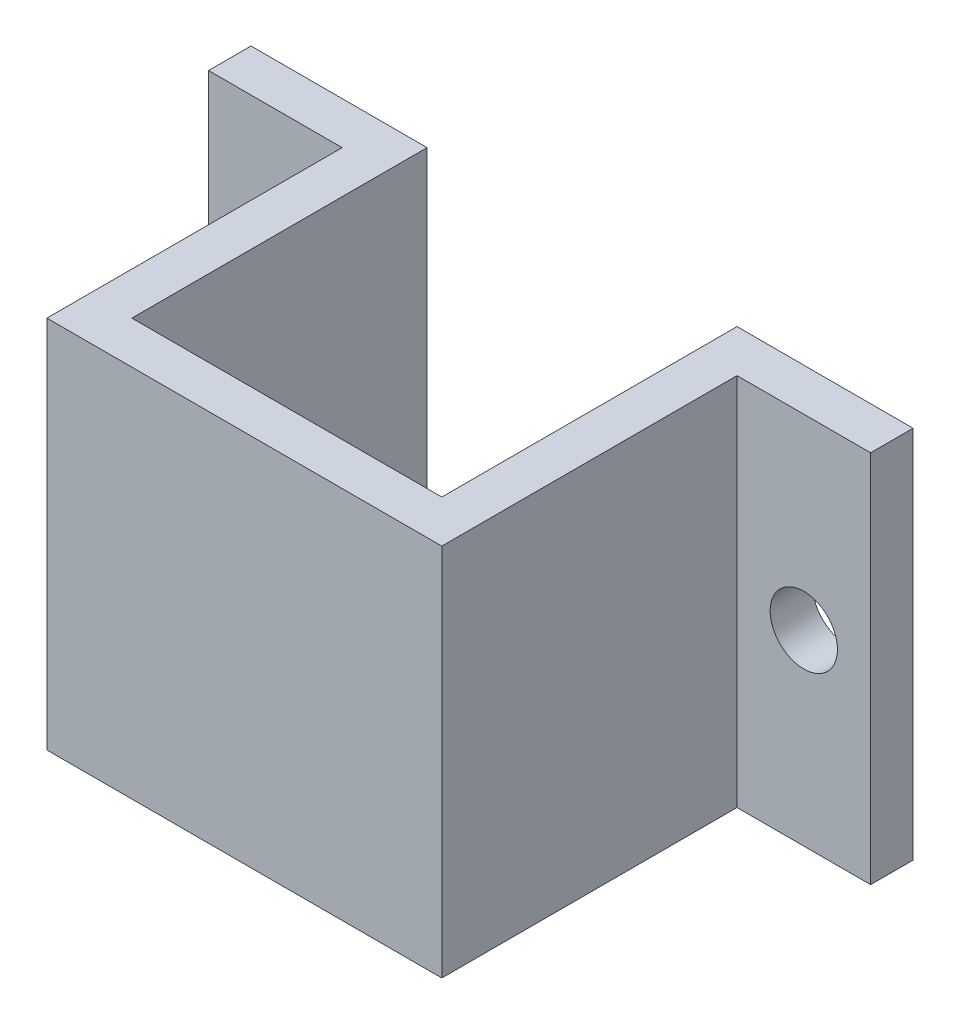
ISO-10303-21;
HEADER;
FILE_DESCRIPTION(('STEP AP214'),'2;1');
FILE_NAME('part.step','',(''),(''),'','','');
FILE_SCHEMA(('AUTOMOTIVE_DESIGN { 1 0 10303 214 1 1 1 1 }'));
ENDSEC;
DATA;
#1=APPLICATION_CONTEXT('core data for automotive mechanical design processes');
#2=APPLICATION_PROTOCOL_DEFINITION('international standard','automotive_design',2000,#1);
#3=PRODUCT_CONTEXT('',#1,'mechanical');
#4=PRODUCT('Part','Part','',(#3));
#5=PRODUCT_RELATED_PRODUCT_CATEGORY('part','',(#4));
#6=PRODUCT_DEFINITION_FORMATION('','',#4);
#7=PRODUCT_DEFINITION_CONTEXT('part definition',#1,'design');
#8=PRODUCT_DEFINITION('design','',#6,#7);
#9=PRODUCT_DEFINITION_SHAPE('','',#8);
#10=(LENGTH_UNIT() NAMED_UNIT(*) SI_UNIT(.MILLI.,.METRE.));
#11=(NAMED_UNIT(*) PLANE_ANGLE_UNIT() SI_UNIT($,.RADIAN.));
#12=(NAMED_UNIT(*) SI_UNIT($,.STERADIAN.) SOLID_ANGLE_UNIT());
#13=UNCERTAINTY_MEASURE_WITH_UNIT(LENGTH_MEASURE(1.E-05),#10,'distance_accuracy_value','');
#14=(GEOMETRIC_REPRESENTATION_CONTEXT(3) GLOBAL_UNCERTAINTY_ASSIGNED_CONTEXT((#13)) GLOBAL_UNIT_ASSIGNED_CONTEXT((#10,
#11,#12)) REPRESENTATION_CONTEXT('',''));
#15=CARTESIAN_POINT('',(0.,0.,0.));
#16=DIRECTION('',(0.,0.,1.));
#17=DIRECTION('',(1.,0.,0.));
#18=AXIS2_PLACEMENT_3D('',#15,#16,#17);
#19=CARTESIAN_POINT('',(-7.39000000000001,14.,-11.05));
#20=DIRECTION('',(1.,0.,0.));
#21=DIRECTION('',(0.,0.,-1.));
#22=AXIS2_PLACEMENT_3D('',#19,#20,#21);
#23=PLANE('',#22);
#24=DIRECTION('',(0.,0.,1.));
#25=VECTOR('',#24,1.);
#26=CARTESIAN_POINT('',(-7.39000000000001,0.,-11.05));
#27=LINE('',#26,#25);
#28=CARTESIAN_POINT('',(-7.39000000000001,0.,-11.05));
#29=VERTEX_POINT('',#28);
#30=CARTESIAN_POINT('',(-7.39,0.,0.));
#31=VERTEX_POINT('',#30);
#32=EDGE_CURVE('E153',#29,#31,#27,.T.);
#33=ORIENTED_EDGE('',*,*,#32,.T.);
#34=DIRECTION('',(0.,-1.,0.));
#35=VECTOR('',#34,1.);
#36=CARTESIAN_POINT('',(-7.39,14.,0.));
#37=LINE('',#36,#35);
#38=CARTESIAN_POINT('',(-7.39,14.,0.));
#39=VERTEX_POINT('',#38);
#40=EDGE_CURVE('E11',#39,#31,#37,.T.);
#41=ORIENTED_EDGE('',*,*,#40,.F.);
#42=DIRECTION('',(0.,0.,1.));
#43=VECTOR('',#42,1.);
#44=CARTESIAN_POINT('',(-7.39000000000001,14.,-11.05));
#45=LINE('',#44,#43);
#46=CARTESIAN_POINT('',(-7.39000000000001,14.,-11.05));
#47=VERTEX_POINT('',#46);
#48=EDGE_CURVE('E176',#47,#39,#45,.T.);
#49=ORIENTED_EDGE('',*,*,#48,.F.);
#50=DIRECTION('',(0.,-1.,0.));
#51=VECTOR('',#50,1.);
#52=CARTESIAN_POINT('',(-7.39000000000001,14.,-11.05));
#53=LINE('',#52,#51);
#54=EDGE_CURVE('E149',#47,#29,#53,.T.);
#55=ORIENTED_EDGE('',*,*,#54,.T.);
#56=EDGE_LOOP('',(#33,#41,#49,#55));
#57=FACE_BOUND('',#56,.T.);
#58=ADVANCED_FACE('F32',(#57),#23,.F.);
#59=CARTESIAN_POINT('',(-7.39,14.,0.));
#60=DIRECTION('',(0.,0.,-1.));
#61=DIRECTION('',(-1.,0.,0.));
#62=AXIS2_PLACEMENT_3D('',#59,#60,#61);
#63=PLANE('',#62);
#64=DIRECTION('',(1.,0.,0.));
#65=VECTOR('',#64,1.);
#66=CARTESIAN_POINT('',(-7.39,0.,0.));
#67=LINE('',#66,#65);
#68=CARTESIAN_POINT('',(7.39,0.,0.));
#69=VERTEX_POINT('',#68);
#70=EDGE_CURVE('E156',#31,#69,#67,.T.);
#71=ORIENTED_EDGE('',*,*,#70,.T.);
#72=DIRECTION('',(0.,-1.,0.));
#73=VECTOR('',#72,1.);
#74=CARTESIAN_POINT('',(7.39,14.,0.));
#75=LINE('',#74,#73);
#76=CARTESIAN_POINT('',(7.39,14.,0.));
#77=VERTEX_POINT('',#76);
#78=EDGE_CURVE('E41',#77,#69,#75,.T.);
#79=ORIENTED_EDGE('',*,*,#78,.F.);
#80=DIRECTION('',(1.,0.,0.));
#81=VECTOR('',#80,1.);
#82=CARTESIAN_POINT('',(-7.39,14.,0.));
#83=LINE('',#82,#81);
#84=EDGE_CURVE('E104',#39,#77,#83,.T.);
#85=ORIENTED_EDGE('',*,*,#84,.F.);
#86=ORIENTED_EDGE('',*,*,#40,.T.);
#87=EDGE_LOOP('',(#71,#79,#85,#86));
#88=FACE_BOUND('',#87,.T.);
#89=ADVANCED_FACE('F257',(#88),#63,.F.);
#90=CARTESIAN_POINT('',(7.39,14.,0.));
#91=DIRECTION('',(-1.,0.,0.));
#92=DIRECTION('',(0.,0.,1.));
#93=AXIS2_PLACEMENT_3D('',#90,#91,#92);
#94=PLANE('',#93);
#95=DIRECTION('',(0.,0.,-1.));
#96=VECTOR('',#95,1.);
#97=CARTESIAN_POINT('',(7.39,0.,0.));
#98=LINE('',#97,#96);
#99=CARTESIAN_POINT('',(7.39,0.,-11.05));
#100=VERTEX_POINT('',#99);
#101=EDGE_CURVE('E159',#69,#100,#98,.T.);
#102=ORIENTED_EDGE('',*,*,#101,.T.);
#103=DIRECTION('',(0.,-1.,0.));
#104=VECTOR('',#103,1.);
#105=CARTESIAN_POINT('',(7.39,14.,-11.05));
#106=LINE('',#105,#104);
#107=CARTESIAN_POINT('',(7.39,14.,-11.05));
#108=VERTEX_POINT('',#107);
#109=EDGE_CURVE('E195',#108,#100,#106,.T.);
#110=ORIENTED_EDGE('',*,*,#109,.F.);
#111=DIRECTION('',(0.,0.,-1.));
#112=VECTOR('',#111,1.);
#113=CARTESIAN_POINT('',(7.39,14.,0.));
#114=LINE('',#113,#112);
#115=EDGE_CURVE('E204',#77,#108,#114,.T.);
#116=ORIENTED_EDGE('',*,*,#115,.F.);
#117=ORIENTED_EDGE('',*,*,#78,.T.);
#118=EDGE_LOOP('',(#102,#110,#116,#117));
#119=FACE_BOUND('',#118,.T.);
#120=ADVANCED_FACE('F202',(#119),#94,.F.);
#121=CARTESIAN_POINT('',(7.39,14.,-11.05));
#122=DIRECTION('',(0.,0.,-1.));
#123=DIRECTION('',(-1.,0.,0.));
#124=AXIS2_PLACEMENT_3D('',#121,#122,#123);
#125=PLANE('',#124);
#126=CARTESIAN_POINT('',(9.88999999999999,7.,-11.05));
#127=DIRECTION('',(0.,0.,1.));
#128=DIRECTION('',(1.,0.,0.));
#129=AXIS2_PLACEMENT_3D('',#126,#127,#128);
#130=CIRCLE('',#129,1.2591140011297);
#131=CARTESIAN_POINT('',(11.1491140011297,7.,-11.05));
#132=VERTEX_POINT('',#131);
#133=EDGE_CURVE('E297',#132,#132,#130,.T.);
#134=ORIENTED_EDGE('',*,*,#133,.F.);
#135=EDGE_LOOP('',(#134));
#136=FACE_BOUND('',#135,.T.);
#137=DIRECTION('',(1.,0.,0.));
#138=VECTOR('',#137,1.);
#139=CARTESIAN_POINT('',(7.39,0.,-11.05));
#140=LINE('',#139,#138);
#141=CARTESIAN_POINT('',(12.39,0.,-11.05));
#142=VERTEX_POINT('',#141);
#143=EDGE_CURVE('E161',#100,#142,#140,.T.);
#144=ORIENTED_EDGE('',*,*,#143,.T.);
#145=DIRECTION('',(0.,-1.,0.));
#146=VECTOR('',#145,1.);
#147=CARTESIAN_POINT('',(12.39,14.,-11.05));
#148=LINE('',#147,#146);
#149=CARTESIAN_POINT('',(12.39,14.,-11.05));
#150=VERTEX_POINT('',#149);
#151=EDGE_CURVE('E192',#150,#142,#148,.T.);
#152=ORIENTED_EDGE('',*,*,#151,.F.);
#153=DIRECTION('',(1.,0.,0.));
#154=VECTOR('',#153,1.);
#155=CARTESIAN_POINT('',(7.39,14.,-11.05));
#156=LINE('',#155,#154);
#157=EDGE_CURVE('E222',#108,#150,#156,.T.);
#158=ORIENTED_EDGE('',*,*,#157,.F.);
#159=ORIENTED_EDGE('',*,*,#109,.T.);
#160=EDGE_LOOP('',(#144,#152,#158,#159));
#161=FACE_BOUND('',#160,.T.);
#162=ADVANCED_FACE('F213',(#136,#161),#125,.F.);
#163=CARTESIAN_POINT('',(12.39,14.,-11.05));
#164=DIRECTION('',(-1.,0.,0.));
#165=DIRECTION('',(0.,0.,1.));
#166=AXIS2_PLACEMENT_3D('',#163,#164,#165);
#167=PLANE('',#166);
#168=DIRECTION('',(0.,0.,-1.));
#169=VECTOR('',#168,1.);
#170=CARTESIAN_POINT('',(12.39,0.,-11.05));
#171=LINE('',#170,#169);
#172=CARTESIAN_POINT('',(12.39,0.,-12.64));
#173=VERTEX_POINT('',#172);
#174=EDGE_CURVE('E163',#142,#173,#171,.T.);
#175=ORIENTED_EDGE('',*,*,#174,.T.);
#176=DIRECTION('',(0.,-1.,0.));
#177=VECTOR('',#176,1.);
#178=CARTESIAN_POINT('',(12.39,14.,-12.64));
#179=LINE('',#178,#177);
#180=CARTESIAN_POINT('',(12.39,14.,-12.64));
#181=VERTEX_POINT('',#180);
#182=EDGE_CURVE('E189',#181,#173,#179,.T.);
#183=ORIENTED_EDGE('',*,*,#182,.F.);
#184=DIRECTION('',(0.,0.,-1.));
#185=VECTOR('',#184,1.);
#186=CARTESIAN_POINT('',(12.39,14.,-11.05));
#187=LINE('',#186,#185);
#188=EDGE_CURVE('E219',#150,#181,#187,.T.);
#189=ORIENTED_EDGE('',*,*,#188,.F.);
#190=ORIENTED_EDGE('',*,*,#151,.T.);
#191=EDGE_LOOP('',(#175,#183,#189,#190));
#192=FACE_BOUND('',#191,.T.);
#193=ADVANCED_FACE('F217',(#192),#167,.F.);
#194=CARTESIAN_POINT('',(12.39,14.,-12.64));
#195=DIRECTION('',(0.,0.,1.));
#196=DIRECTION('',(1.,0.,0.));
#197=AXIS2_PLACEMENT_3D('',#194,#195,#196);
#198=PLANE('',#197);
#199=CARTESIAN_POINT('',(9.88999999999999,7.,-12.64));
#200=DIRECTION('',(0.,0.,1.));
#201=DIRECTION('',(1.,0.,0.));
#202=AXIS2_PLACEMENT_3D('',#199,#200,#201);
#203=CIRCLE('',#202,1.2591140011297);
#204=CARTESIAN_POINT('',(11.1491140011297,7.,-12.64));
#205=VERTEX_POINT('',#204);
#206=EDGE_CURVE('E35',#205,#205,#203,.T.);
#207=ORIENTED_EDGE('',*,*,#206,.T.);
#208=EDGE_LOOP('',(#207));
#209=FACE_BOUND('',#208,.T.);
#210=DIRECTION('',(-1.,0.,0.));
#211=VECTOR('',#210,1.);
#212=CARTESIAN_POINT('',(12.39,0.,-12.64));
#213=LINE('',#212,#211);
#214=CARTESIAN_POINT('',(5.8,0.,-12.64));
#215=VERTEX_POINT('',#214);
#216=EDGE_CURVE('E165',#173,#215,#213,.T.);
#217=ORIENTED_EDGE('',*,*,#216,.T.);
#218=DIRECTION('',(0.,-1.,0.));
#219=VECTOR('',#218,1.);
#220=CARTESIAN_POINT('',(5.8,14.,-12.64));
#221=LINE('',#220,#219);
#222=CARTESIAN_POINT('',(5.8,14.,-12.64));
#223=VERTEX_POINT('',#222);
#224=EDGE_CURVE('E186',#223,#215,#221,.T.);
#225=ORIENTED_EDGE('',*,*,#224,.F.);
#226=DIRECTION('',(-1.,0.,0.));
#227=VECTOR('',#226,1.);
#228=CARTESIAN_POINT('',(12.39,14.,-12.64));
#229=LINE('',#228,#227);
#230=EDGE_CURVE('E221',#181,#223,#229,.T.);
#231=ORIENTED_EDGE('',*,*,#230,.F.);
#232=ORIENTED_EDGE('',*,*,#182,.T.);
#233=EDGE_LOOP('',(#217,#225,#231,#232));
#234=FACE_BOUND('',#233,.T.);
#235=ADVANCED_FACE('F271',(#209,#234),#198,.F.);
#236=CARTESIAN_POINT('',(5.8,14.,-12.64));
#237=DIRECTION('',(1.,0.,0.));
#238=DIRECTION('',(0.,0.,-1.));
#239=AXIS2_PLACEMENT_3D('',#236,#237,#238);
#240=PLANE('',#239);
#241=DIRECTION('',(0.,0.,1.));
#242=VECTOR('',#241,1.);
#243=CARTESIAN_POINT('',(5.8,0.,-12.64));
#244=LINE('',#243,#242);
#245=CARTESIAN_POINT('',(5.8,0.,-1.59));
#246=VERTEX_POINT('',#245);
#247=EDGE_CURVE('E167',#215,#246,#244,.T.);
#248=ORIENTED_EDGE('',*,*,#247,.T.);
#249=DIRECTION('',(0.,-1.,0.));
#250=VECTOR('',#249,1.);
#251=CARTESIAN_POINT('',(5.8,14.,-1.59));
#252=LINE('',#251,#250);
#253=CARTESIAN_POINT('',(5.8,14.,-1.59));
#254=VERTEX_POINT('',#253);
#255=EDGE_CURVE('E183',#254,#246,#252,.T.);
#256=ORIENTED_EDGE('',*,*,#255,.F.);
#257=DIRECTION('',(0.,0.,1.));
#258=VECTOR('',#257,1.);
#259=CARTESIAN_POINT('',(5.8,14.,-12.64));
#260=LINE('',#259,#258);
#261=EDGE_CURVE('E224',#223,#254,#260,.T.);
#262=ORIENTED_EDGE('',*,*,#261,.F.);
#263=ORIENTED_EDGE('',*,*,#224,.T.);
#264=EDGE_LOOP('',(#248,#256,#262,#263));
#265=FACE_BOUND('',#264,.T.);
#266=ADVANCED_FACE('F274',(#265),#240,.F.);
#267=CARTESIAN_POINT('',(5.8,14.,-1.59));
#268=DIRECTION('',(0.,0.,1.));
#269=DIRECTION('',(1.,0.,0.));
#270=AXIS2_PLACEMENT_3D('',#267,#268,#269);
#271=PLANE('',#270);
#272=DIRECTION('',(-1.,0.,0.));
#273=VECTOR('',#272,1.);
#274=CARTESIAN_POINT('',(5.8,0.,-1.59));
#275=LINE('',#274,#273);
#276=CARTESIAN_POINT('',(-5.8,0.,-1.59));
#277=VERTEX_POINT('',#276);
#278=EDGE_CURVE('E169',#246,#277,#275,.T.);
#279=ORIENTED_EDGE('',*,*,#278,.T.);
#280=DIRECTION('',(0.,-1.,0.));
#281=VECTOR('',#280,1.);
#282=CARTESIAN_POINT('',(-5.8,14.,-1.59));
#283=LINE('',#282,#281);
#284=CARTESIAN_POINT('',(-5.8,14.,-1.59));
#285=VERTEX_POINT('',#284);
#286=EDGE_CURVE('E180',#285,#277,#283,.T.);
#287=ORIENTED_EDGE('',*,*,#286,.F.);
#288=DIRECTION('',(-1.,0.,0.));
#289=VECTOR('',#288,1.);
#290=CARTESIAN_POINT('',(5.8,14.,-1.59));
#291=LINE('',#290,#289);
#292=EDGE_CURVE('E230',#254,#285,#291,.T.);
#293=ORIENTED_EDGE('',*,*,#292,.F.);
#294=ORIENTED_EDGE('',*,*,#255,.T.);
#295=EDGE_LOOP('',(#279,#287,#293,#294));
#296=FACE_BOUND('',#295,.T.);
#297=ADVANCED_FACE('F236',(#296),#271,.F.);
#298=CARTESIAN_POINT('',(-5.8,14.,-1.59));
#299=DIRECTION('',(-1.,0.,0.));
#300=DIRECTION('',(0.,0.,1.));
#301=AXIS2_PLACEMENT_3D('',#298,#299,#300);
#302=PLANE('',#301);
#303=DIRECTION('',(0.,0.,-1.));
#304=VECTOR('',#303,1.);
#305=CARTESIAN_POINT('',(-5.8,0.,-1.59));
#306=LINE('',#305,#304);
#307=CARTESIAN_POINT('',(-5.8,0.,-12.64));
#308=VERTEX_POINT('',#307);
#309=EDGE_CURVE('E171',#277,#308,#306,.T.);
#310=ORIENTED_EDGE('',*,*,#309,.T.);
#311=DIRECTION('',(0.,-1.,0.));
#312=VECTOR('',#311,1.);
#313=CARTESIAN_POINT('',(-5.8,14.,-12.64));
#314=LINE('',#313,#312);
#315=CARTESIAN_POINT('',(-5.8,14.,-12.64));
#316=VERTEX_POINT('',#315);
#317=EDGE_CURVE('E144',#316,#308,#314,.T.);
#318=ORIENTED_EDGE('',*,*,#317,.F.);
#319=DIRECTION('',(0.,0.,-1.));
#320=VECTOR('',#319,1.);
#321=CARTESIAN_POINT('',(-5.8,14.,-1.59));
#322=LINE('',#321,#320);
#323=EDGE_CURVE('E135',#285,#316,#322,.T.);
#324=ORIENTED_EDGE('',*,*,#323,.F.);
#325=ORIENTED_EDGE('',*,*,#286,.T.);
#326=EDGE_LOOP('',(#310,#318,#324,#325));
#327=FACE_BOUND('',#326,.T.);
#328=ADVANCED_FACE('F240',(#327),#302,.F.);
#329=CARTESIAN_POINT('',(-5.8,14.,-12.64));
#330=DIRECTION('',(0.,0.,1.));
#331=DIRECTION('',(1.,0.,0.));
#332=AXIS2_PLACEMENT_3D('',#329,#330,#331);
#333=PLANE('',#332);
#334=CARTESIAN_POINT('',(-9.89,7.,-12.64));
#335=DIRECTION('',(0.,0.,1.));
#336=DIRECTION('',(1.,0.,0.));
#337=AXIS2_PLACEMENT_3D('',#334,#335,#336);
#338=CIRCLE('',#337,1.2591140011297);
#339=CARTESIAN_POINT('',(-8.6308859988703,7.,-12.64));
#340=VERTEX_POINT('',#339);
#341=EDGE_CURVE('E157',#340,#340,#338,.T.);
#342=ORIENTED_EDGE('',*,*,#341,.T.);
#343=EDGE_LOOP('',(#342));
#344=FACE_BOUND('',#343,.T.);
#345=DIRECTION('',(-1.,0.,0.));
#346=VECTOR('',#345,1.);
#347=CARTESIAN_POINT('',(-5.8,0.,-12.64));
#348=LINE('',#347,#346);
#349=CARTESIAN_POINT('',(-12.39,0.,-12.64));
#350=VERTEX_POINT('',#349);
#351=EDGE_CURVE('E143',#308,#350,#348,.T.);
#352=ORIENTED_EDGE('',*,*,#351,.T.);
#353=DIRECTION('',(0.,-1.,0.));
#354=VECTOR('',#353,1.);
#355=CARTESIAN_POINT('',(-12.39,14.,-12.64));
#356=LINE('',#355,#354);
#357=CARTESIAN_POINT('',(-12.39,14.,-12.64));
#358=VERTEX_POINT('',#357);
#359=EDGE_CURVE('E140',#358,#350,#356,.T.);
#360=ORIENTED_EDGE('',*,*,#359,.F.);
#361=DIRECTION('',(-1.,0.,0.));
#362=VECTOR('',#361,1.);
#363=CARTESIAN_POINT('',(-5.8,14.,-12.64));
#364=LINE('',#363,#362);
#365=EDGE_CURVE('E129',#316,#358,#364,.T.);
#366=ORIENTED_EDGE('',*,*,#365,.F.);
#367=ORIENTED_EDGE('',*,*,#317,.T.);
#368=EDGE_LOOP('',(#352,#360,#366,#367));
#369=FACE_BOUND('',#368,.T.);
#370=ADVANCED_FACE('F141',(#344,#369),#333,.F.);
#371=CARTESIAN_POINT('',(-12.39,14.,-12.64));
#372=DIRECTION('',(1.,0.,0.));
#373=DIRECTION('',(0.,0.,-1.));
#374=AXIS2_PLACEMENT_3D('',#371,#372,#373);
#375=PLANE('',#374);
#376=DIRECTION('',(0.,0.,1.));
#377=VECTOR('',#376,1.);
#378=CARTESIAN_POINT('',(-12.39,0.,-12.64));
#379=LINE('',#378,#377);
#380=CARTESIAN_POINT('',(-12.39,0.,-11.05));
#381=VERTEX_POINT('',#380);
#382=EDGE_CURVE('E90',#350,#381,#379,.T.);
#383=ORIENTED_EDGE('',*,*,#382,.T.);
#384=DIRECTION('',(0.,-1.,0.));
#385=VECTOR('',#384,1.);
#386=CARTESIAN_POINT('',(-12.39,14.,-11.05));
#387=LINE('',#386,#385);
#388=CARTESIAN_POINT('',(-12.39,14.,-11.05));
#389=VERTEX_POINT('',#388);
#390=EDGE_CURVE('E145',#389,#381,#387,.T.);
#391=ORIENTED_EDGE('',*,*,#390,.F.);
#392=DIRECTION('',(0.,0.,1.));
#393=VECTOR('',#392,1.);
#394=CARTESIAN_POINT('',(-12.39,14.,-12.64));
#395=LINE('',#394,#393);
#396=EDGE_CURVE('E133',#358,#389,#395,.T.);
#397=ORIENTED_EDGE('',*,*,#396,.F.);
#398=ORIENTED_EDGE('',*,*,#359,.T.);
#399=EDGE_LOOP('',(#383,#391,#397,#398));
#400=FACE_BOUND('',#399,.T.);
#401=ADVANCED_FACE('F147',(#400),#375,.F.);
#402=CARTESIAN_POINT('',(-12.39,14.,-11.05));
#403=DIRECTION('',(0.,0.,-1.));
#404=DIRECTION('',(-1.,0.,0.));
#405=AXIS2_PLACEMENT_3D('',#402,#403,#404);
#406=PLANE('',#405);
#407=CARTESIAN_POINT('',(-9.89,7.,-11.05));
#408=DIRECTION('',(0.,0.,1.));
#409=DIRECTION('',(1.,0.,0.));
#410=AXIS2_PLACEMENT_3D('',#407,#408,#409);
#411=CIRCLE('',#410,1.2591140011297);
#412=CARTESIAN_POINT('',(-8.6308859988703,7.,-11.05));
#413=VERTEX_POINT('',#412);
#414=EDGE_CURVE('E290',#413,#413,#411,.T.);
#415=ORIENTED_EDGE('',*,*,#414,.F.);
#416=EDGE_LOOP('',(#415));
#417=FACE_BOUND('',#416,.T.);
#418=DIRECTION('',(1.,0.,0.));
#419=VECTOR('',#418,1.);
#420=CARTESIAN_POINT('',(-12.39,0.,-11.05));
#421=LINE('',#420,#419);
#422=EDGE_CURVE('E96',#381,#29,#421,.T.);
#423=ORIENTED_EDGE('',*,*,#422,.T.);
#424=ORIENTED_EDGE('',*,*,#54,.F.);
#425=DIRECTION('',(1.,0.,0.));
#426=VECTOR('',#425,1.);
#427=CARTESIAN_POINT('',(-12.39,14.,-11.05));
#428=LINE('',#427,#426);
#429=EDGE_CURVE('E49',#389,#47,#428,.T.);
#430=ORIENTED_EDGE('',*,*,#429,.F.);
#431=ORIENTED_EDGE('',*,*,#390,.T.);
#432=EDGE_LOOP('',(#423,#424,#430,#431));
#433=FACE_BOUND('',#432,.T.);
#434=ADVANCED_FACE('F244',(#417,#433),#406,.F.);
#435=CARTESIAN_POINT('',(0.,14.,0.));
#436=DIRECTION('',(0.,1.,0.));
#437=DIRECTION('',(0.,0.,1.));
#438=AXIS2_PLACEMENT_3D('',#435,#436,#437);
#439=PLANE('',#438);
#440=ORIENTED_EDGE('',*,*,#48,.T.);
#441=ORIENTED_EDGE('',*,*,#84,.T.);
#442=ORIENTED_EDGE('',*,*,#115,.T.);
#443=ORIENTED_EDGE('',*,*,#157,.T.);
#444=ORIENTED_EDGE('',*,*,#188,.T.);
#445=ORIENTED_EDGE('',*,*,#230,.T.);
#446=ORIENTED_EDGE('',*,*,#261,.T.);
#447=ORIENTED_EDGE('',*,*,#292,.T.);
#448=ORIENTED_EDGE('',*,*,#323,.T.);
#449=ORIENTED_EDGE('',*,*,#365,.T.);
#450=ORIENTED_EDGE('',*,*,#396,.T.);
#451=ORIENTED_EDGE('',*,*,#429,.T.);
#452=EDGE_LOOP('',(#440,#441,#442,#443,#444,#445,#446,#447,#448,#449,#450,#451));
#453=FACE_BOUND('',#452,.T.);
#454=ADVANCED_FACE('F131',(#453),#439,.T.);
#455=CARTESIAN_POINT('',(0.,0.,0.));
#456=DIRECTION('',(0.,1.,0.));
#457=DIRECTION('',(0.,0.,1.));
#458=AXIS2_PLACEMENT_3D('',#455,#456,#457);
#459=PLANE('',#458);
#460=ORIENTED_EDGE('',*,*,#32,.F.);
#461=ORIENTED_EDGE('',*,*,#422,.F.);
#462=ORIENTED_EDGE('',*,*,#382,.F.);
#463=ORIENTED_EDGE('',*,*,#351,.F.);
#464=ORIENTED_EDGE('',*,*,#309,.F.);
#465=ORIENTED_EDGE('',*,*,#278,.F.);
#466=ORIENTED_EDGE('',*,*,#247,.F.);
#467=ORIENTED_EDGE('',*,*,#216,.F.);
#468=ORIENTED_EDGE('',*,*,#174,.F.);
#469=ORIENTED_EDGE('',*,*,#143,.F.);
#470=ORIENTED_EDGE('',*,*,#101,.F.);
#471=ORIENTED_EDGE('',*,*,#70,.F.);
#472=EDGE_LOOP('',(#460,#461,#462,#463,#464,#465,#466,#467,#468,#469,#470,#471));
#473=FACE_BOUND('',#472,.T.);
#474=ADVANCED_FACE('F208',(#473),#459,.F.);
#475=CARTESIAN_POINT('',(-9.89,7.,-25.05));
#476=DIRECTION('',(0.,0.,1.));
#477=DIRECTION('',(1.,0.,0.));
#478=AXIS2_PLACEMENT_3D('',#475,#476,#477);
#479=CYLINDRICAL_SURFACE('',#478,1.2591140011297);
#480=ORIENTED_EDGE('',*,*,#414,.T.);
#481=EDGE_LOOP('',(#480));
#482=FACE_BOUND('',#481,.T.);
#483=ORIENTED_EDGE('',*,*,#341,.F.);
#484=EDGE_LOOP('',(#483));
#485=FACE_BOUND('',#484,.T.);
#486=ADVANCED_FACE('F307',(#482,#485),#479,.F.);
#487=CARTESIAN_POINT('',(9.88999999999999,7.,-25.05));
#488=DIRECTION('',(0.,0.,1.));
#489=DIRECTION('',(1.,0.,0.));
#490=AXIS2_PLACEMENT_3D('',#487,#488,#489);
#491=CYLINDRICAL_SURFACE('',#490,1.2591140011297);
#492=ORIENTED_EDGE('',*,*,#133,.T.);
#493=EDGE_LOOP('',(#492));
#494=FACE_BOUND('',#493,.T.);
#495=ORIENTED_EDGE('',*,*,#206,.F.);
#496=EDGE_LOOP('',(#495));
#497=FACE_BOUND('',#496,.T.);
#498=ADVANCED_FACE('F305',(#494,#497),#491,.F.);
#499=CLOSED_SHELL('',(#58,#89,#120,#162,#193,#235,#266,#297,#328,#370,#401,#434,#454,#474,#486,#498));
#500=MANIFOLD_SOLID_BREP('B2',#499);
#501=ADVANCED_BREP_SHAPE_REPRESENTATION('',(#18,#500),#14);
#502=SHAPE_DEFINITION_REPRESENTATION(#9,#501);
ENDSEC;
END-ISO-10303-21;
